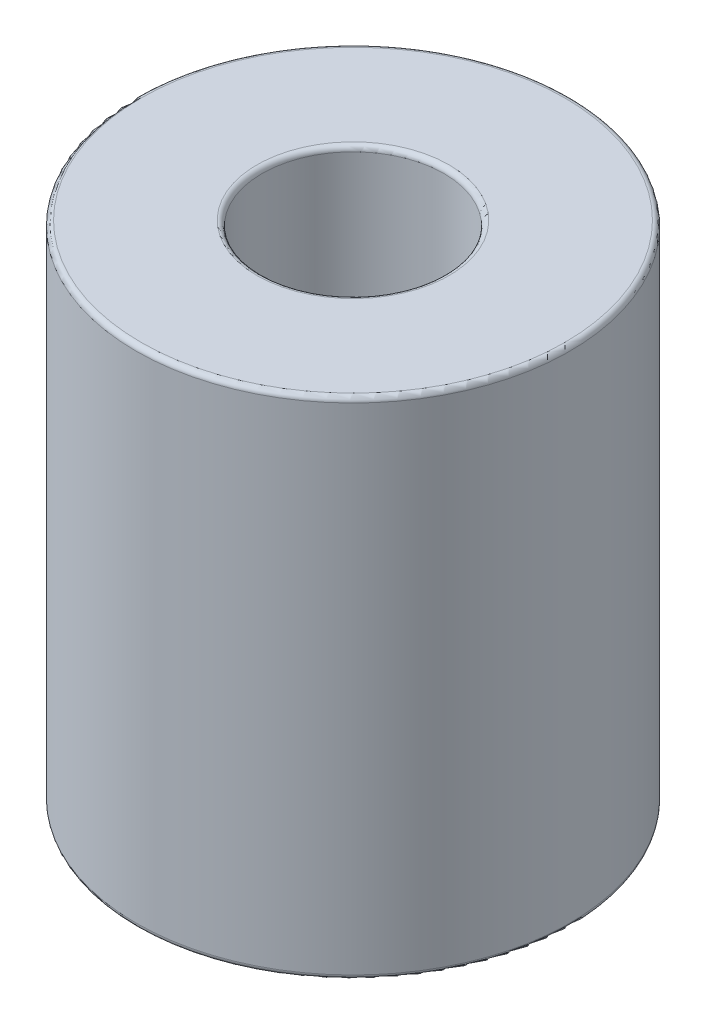
ISO-10303-21;
HEADER;
FILE_DESCRIPTION(('STEP AP214'),'2;1');
FILE_NAME('part.step','',(''),(''),'','','');
FILE_SCHEMA(('AUTOMOTIVE_DESIGN { 1 0 10303 214 1 1 1 1 }'));
ENDSEC;
DATA;
#1=APPLICATION_CONTEXT('core data for automotive mechanical design processes');
#2=APPLICATION_PROTOCOL_DEFINITION('international standard','automotive_design',2000,#1);
#3=PRODUCT_CONTEXT('',#1,'mechanical');
#4=PRODUCT('Part','Part','',(#3));
#5=PRODUCT_RELATED_PRODUCT_CATEGORY('part','',(#4));
#6=PRODUCT_DEFINITION_FORMATION('','',#4);
#7=PRODUCT_DEFINITION_CONTEXT('part definition',#1,'design');
#8=PRODUCT_DEFINITION('design','',#6,#7);
#9=PRODUCT_DEFINITION_SHAPE('','',#8);
#10=(LENGTH_UNIT() NAMED_UNIT(*) SI_UNIT(.MILLI.,.METRE.));
#11=(NAMED_UNIT(*) PLANE_ANGLE_UNIT() SI_UNIT($,.RADIAN.));
#12=(NAMED_UNIT(*) SI_UNIT($,.STERADIAN.) SOLID_ANGLE_UNIT());
#13=UNCERTAINTY_MEASURE_WITH_UNIT(LENGTH_MEASURE(1.E-05),#10,'distance_accuracy_value','');
#14=(GEOMETRIC_REPRESENTATION_CONTEXT(3) GLOBAL_UNCERTAINTY_ASSIGNED_CONTEXT((#13)) GLOBAL_UNIT_ASSIGNED_CONTEXT((#10,
#11,#12)) REPRESENTATION_CONTEXT('',''));
#15=CARTESIAN_POINT('',(0.,0.,0.));
#16=DIRECTION('',(0.,0.,1.));
#17=DIRECTION('',(1.,0.,0.));
#18=AXIS2_PLACEMENT_3D('',#15,#16,#17);
#19=CARTESIAN_POINT('',(0.,43.463768920522,0.));
#20=DIRECTION('',(0.,1.,0.));
#21=DIRECTION('',(0.,0.,1.));
#22=AXIS2_PLACEMENT_3D('',#19,#20,#21);
#23=CYLINDRICAL_SURFACE('',#22,0.899999999999995);
#24=CARTESIAN_POINT('',(0.,2.45,0.));
#25=DIRECTION('',(0.,1.,0.));
#26=DIRECTION('',(0.,0.,1.));
#27=AXIS2_PLACEMENT_3D('',#24,#25,#26);
#28=CIRCLE('',#27,0.899999999999995);
#29=CARTESIAN_POINT('',(0.,2.45,0.899999999999995));
#30=VERTEX_POINT('',#29);
#31=EDGE_CURVE('E68',#30,#30,#28,.F.);
#32=ORIENTED_EDGE('',*,*,#31,.F.);
#33=EDGE_LOOP('',(#32));
#34=FACE_BOUND('',#33,.T.);
#35=CARTESIAN_POINT('',(0.,-2.45,0.));
#36=DIRECTION('',(0.,1.,0.));
#37=DIRECTION('',(0.,0.,1.));
#38=AXIS2_PLACEMENT_3D('',#35,#36,#37);
#39=CIRCLE('',#38,0.899999999999994);
#40=CARTESIAN_POINT('',(0.,-2.45,0.899999999999994));
#41=VERTEX_POINT('',#40);
#42=EDGE_CURVE('E242',#41,#41,#39,.T.);
#43=ORIENTED_EDGE('',*,*,#42,.F.);
#44=EDGE_LOOP('',(#43));
#45=FACE_BOUND('',#44,.T.);
#46=ADVANCED_FACE('F17',(#34,#45),#23,.F.);
#47=CARTESIAN_POINT('',(0.,-2.45,0.));
#48=DIRECTION('',(0.,1.,0.));
#49=DIRECTION('',(0.,0.,1.));
#50=AXIS2_PLACEMENT_3D('',#47,#48,#49);
#51=TOROIDAL_SURFACE('',#50,0.949999999999994,0.0500000000000001);
#52=ORIENTED_EDGE('',*,*,#42,.T.);
#53=EDGE_LOOP('',(#52));
#54=FACE_BOUND('',#53,.T.);
#55=CARTESIAN_POINT('',(0.,-2.5,0.));
#56=DIRECTION('',(0.,-1.,0.));
#57=DIRECTION('',(0.,0.,1.));
#58=AXIS2_PLACEMENT_3D('',#55,#56,#57);
#59=CIRCLE('',#58,0.949999999999995);
#60=CARTESIAN_POINT('',(0.,-2.5,-0.949999999999995));
#61=VERTEX_POINT('',#60);
#62=CARTESIAN_POINT('',(0.,-2.5,0.949999999999995));
#63=VERTEX_POINT('',#62);
#64=EDGE_CURVE('E58',#61,#63,#59,.F.);
#65=ORIENTED_EDGE('',*,*,#64,.F.);
#66=CARTESIAN_POINT('',(0.,-2.5,0.));
#67=DIRECTION('',(0.,-1.,0.));
#68=DIRECTION('',(0.,0.,-1.));
#69=AXIS2_PLACEMENT_3D('',#66,#67,#68);
#70=CIRCLE('',#69,0.949999999999995);
#71=EDGE_CURVE('E56',#63,#61,#70,.F.);
#72=ORIENTED_EDGE('',*,*,#71,.F.);
#73=EDGE_LOOP('',(#65,#72));
#74=FACE_BOUND('',#73,.T.);
#75=ADVANCED_FACE('F60',(#54,#74),#51,.T.);
#76=CARTESIAN_POINT('',(0.,2.45,0.));
#77=DIRECTION('',(0.,1.,0.));
#78=DIRECTION('',(0.,0.,1.));
#79=AXIS2_PLACEMENT_3D('',#76,#77,#78);
#80=TOROIDAL_SURFACE('',#79,0.949999999999995,0.0500000000000001);
#81=CARTESIAN_POINT('',(0.,2.5,0.));
#82=DIRECTION('',(0.,1.,0.));
#83=DIRECTION('',(0.,0.,1.));
#84=AXIS2_PLACEMENT_3D('',#81,#82,#83);
#85=CIRCLE('',#84,0.949999999999995);
#86=CARTESIAN_POINT('',(0.,2.5,-0.949999999999995));
#87=VERTEX_POINT('',#86);
#88=CARTESIAN_POINT('',(0.,2.5,0.949999999999995));
#89=VERTEX_POINT('',#88);
#90=EDGE_CURVE('E63',#87,#89,#85,.F.);
#91=ORIENTED_EDGE('',*,*,#90,.F.);
#92=CARTESIAN_POINT('',(0.,2.5,0.));
#93=DIRECTION('',(0.,1.,0.));
#94=DIRECTION('',(0.,0.,-1.));
#95=AXIS2_PLACEMENT_3D('',#92,#93,#94);
#96=CIRCLE('',#95,0.949999999999995);
#97=EDGE_CURVE('E176',#89,#87,#96,.F.);
#98=ORIENTED_EDGE('',*,*,#97,.F.);
#99=EDGE_LOOP('',(#91,#98));
#100=FACE_BOUND('',#99,.T.);
#101=ORIENTED_EDGE('',*,*,#31,.T.);
#102=EDGE_LOOP('',(#101));
#103=FACE_BOUND('',#102,.T.);
#104=ADVANCED_FACE('F85',(#100,#103),#80,.T.);
#105=CARTESIAN_POINT('',(-0.949999999999995,-2.5,0.));
#106=DIRECTION('',(0.,-1.,0.));
#107=DIRECTION('',(0.,0.,-1.));
#108=AXIS2_PLACEMENT_3D('',#105,#106,#107);
#109=PLANE('',#108);
#110=CARTESIAN_POINT('',(0.,-2.5,0.));
#111=DIRECTION('',(0.,1.,0.));
#112=DIRECTION('',(0.,0.,1.));
#113=AXIS2_PLACEMENT_3D('',#110,#111,#112);
#114=CIRCLE('',#113,2.09499999999999);
#115=CARTESIAN_POINT('',(0.,-2.5,2.09499999999999));
#116=VERTEX_POINT('',#115);
#117=CARTESIAN_POINT('',(0.,-2.5,-2.09499999999999));
#118=VERTEX_POINT('',#117);
#119=EDGE_CURVE('E120',#116,#118,#114,.T.);
#120=ORIENTED_EDGE('',*,*,#119,.F.);
#121=CARTESIAN_POINT('',(0.,-2.5,0.));
#122=DIRECTION('',(0.,1.,0.));
#123=DIRECTION('',(0.,0.,-1.));
#124=AXIS2_PLACEMENT_3D('',#121,#122,#123);
#125=CIRCLE('',#124,2.09499999999999);
#126=EDGE_CURVE('E108',#118,#116,#125,.T.);
#127=ORIENTED_EDGE('',*,*,#126,.F.);
#128=EDGE_LOOP('',(#120,#127));
#129=FACE_BOUND('',#128,.T.);
#130=ORIENTED_EDGE('',*,*,#71,.T.);
#131=ORIENTED_EDGE('',*,*,#64,.T.);
#132=EDGE_LOOP('',(#130,#131));
#133=FACE_BOUND('',#132,.T.);
#134=ADVANCED_FACE('F67',(#129,#133),#109,.T.);
#135=CARTESIAN_POINT('',(-2.09499999999999,2.5,0.));
#136=DIRECTION('',(0.,1.,0.));
#137=DIRECTION('',(0.,0.,1.));
#138=AXIS2_PLACEMENT_3D('',#135,#136,#137);
#139=PLANE('',#138);
#140=ORIENTED_EDGE('',*,*,#90,.T.);
#141=ORIENTED_EDGE('',*,*,#97,.T.);
#142=EDGE_LOOP('',(#140,#141));
#143=FACE_BOUND('',#142,.T.);
#144=CARTESIAN_POINT('',(0.,2.5,0.));
#145=DIRECTION('',(0.,-1.,0.));
#146=DIRECTION('',(0.,0.,-1.));
#147=AXIS2_PLACEMENT_3D('',#144,#145,#146);
#148=CIRCLE('',#147,2.09499999999999);
#149=CARTESIAN_POINT('',(0.,2.5,-2.09499999999999));
#150=VERTEX_POINT('',#149);
#151=CARTESIAN_POINT('',(0.,2.5,2.09499999999999));
#152=VERTEX_POINT('',#151);
#153=EDGE_CURVE('E146',#150,#152,#148,.T.);
#154=ORIENTED_EDGE('',*,*,#153,.F.);
#155=CARTESIAN_POINT('',(0.,2.5,0.));
#156=DIRECTION('',(0.,-1.,0.));
#157=DIRECTION('',(0.,0.,1.));
#158=AXIS2_PLACEMENT_3D('',#155,#156,#157);
#159=CIRCLE('',#158,2.09499999999999);
#160=EDGE_CURVE('E35',#152,#150,#159,.T.);
#161=ORIENTED_EDGE('',*,*,#160,.F.);
#162=EDGE_LOOP('',(#154,#161));
#163=FACE_BOUND('',#162,.T.);
#164=ADVANCED_FACE('F84',(#143,#163),#139,.T.);
#165=CARTESIAN_POINT('',(0.,-2.45,0.));
#166=DIRECTION('',(0.,1.,0.));
#167=DIRECTION('',(0.,0.,1.));
#168=AXIS2_PLACEMENT_3D('',#165,#166,#167);
#169=TOROIDAL_SURFACE('',#168,2.09499999999999,0.0500000000000001);
#170=CARTESIAN_POINT('',(0.,-2.45,0.));
#171=DIRECTION('',(0.,1.,0.));
#172=DIRECTION('',(0.,0.,1.));
#173=AXIS2_PLACEMENT_3D('',#170,#171,#172);
#174=CIRCLE('',#173,2.14499999999999);
#175=CARTESIAN_POINT('',(0.,-2.45,2.14499999999999));
#176=VERTEX_POINT('',#175);
#177=EDGE_CURVE('E27',#176,#176,#174,.T.);
#178=ORIENTED_EDGE('',*,*,#177,.F.);
#179=EDGE_LOOP('',(#178));
#180=FACE_BOUND('',#179,.T.);
#181=ORIENTED_EDGE('',*,*,#119,.T.);
#182=ORIENTED_EDGE('',*,*,#126,.T.);
#183=EDGE_LOOP('',(#181,#182));
#184=FACE_BOUND('',#183,.T.);
#185=ADVANCED_FACE('F125',(#180,#184),#169,.T.);
#186=CARTESIAN_POINT('',(0.,2.45,0.));
#187=DIRECTION('',(0.,1.,0.));
#188=DIRECTION('',(0.,0.,1.));
#189=AXIS2_PLACEMENT_3D('',#186,#187,#188);
#190=TOROIDAL_SURFACE('',#189,2.09499999999999,0.0500000000000001);
#191=ORIENTED_EDGE('',*,*,#160,.T.);
#192=ORIENTED_EDGE('',*,*,#153,.T.);
#193=EDGE_LOOP('',(#191,#192));
#194=FACE_BOUND('',#193,.T.);
#195=CARTESIAN_POINT('',(0.,2.45,0.));
#196=DIRECTION('',(0.,1.,0.));
#197=DIRECTION('',(0.,0.,1.));
#198=AXIS2_PLACEMENT_3D('',#195,#196,#197);
#199=CIRCLE('',#198,2.14499999999999);
#200=CARTESIAN_POINT('',(0.,2.45,2.14499999999999));
#201=VERTEX_POINT('',#200);
#202=EDGE_CURVE('E11',#201,#201,#199,.F.);
#203=ORIENTED_EDGE('',*,*,#202,.F.);
#204=EDGE_LOOP('',(#203));
#205=FACE_BOUND('',#204,.T.);
#206=ADVANCED_FACE('F135',(#194,#205),#190,.T.);
#207=CARTESIAN_POINT('',(0.,43.463768920522,0.));
#208=DIRECTION('',(0.,1.,0.));
#209=DIRECTION('',(0.,0.,1.));
#210=AXIS2_PLACEMENT_3D('',#207,#208,#209);
#211=CYLINDRICAL_SURFACE('',#210,2.14499999999999);
#212=ORIENTED_EDGE('',*,*,#202,.T.);
#213=EDGE_LOOP('',(#212));
#214=FACE_BOUND('',#213,.T.);
#215=ORIENTED_EDGE('',*,*,#177,.T.);
#216=EDGE_LOOP('',(#215));
#217=FACE_BOUND('',#216,.T.);
#218=ADVANCED_FACE('F252',(#214,#217),#211,.T.);
#219=CLOSED_SHELL('',(#46,#75,#104,#134,#164,#185,#206,#218));
#220=MANIFOLD_SOLID_BREP('B1',#219);
#221=ADVANCED_BREP_SHAPE_REPRESENTATION('',(#18,#220),#14);
#222=SHAPE_DEFINITION_REPRESENTATION(#9,#221);
ENDSEC;
END-ISO-10303-21;
